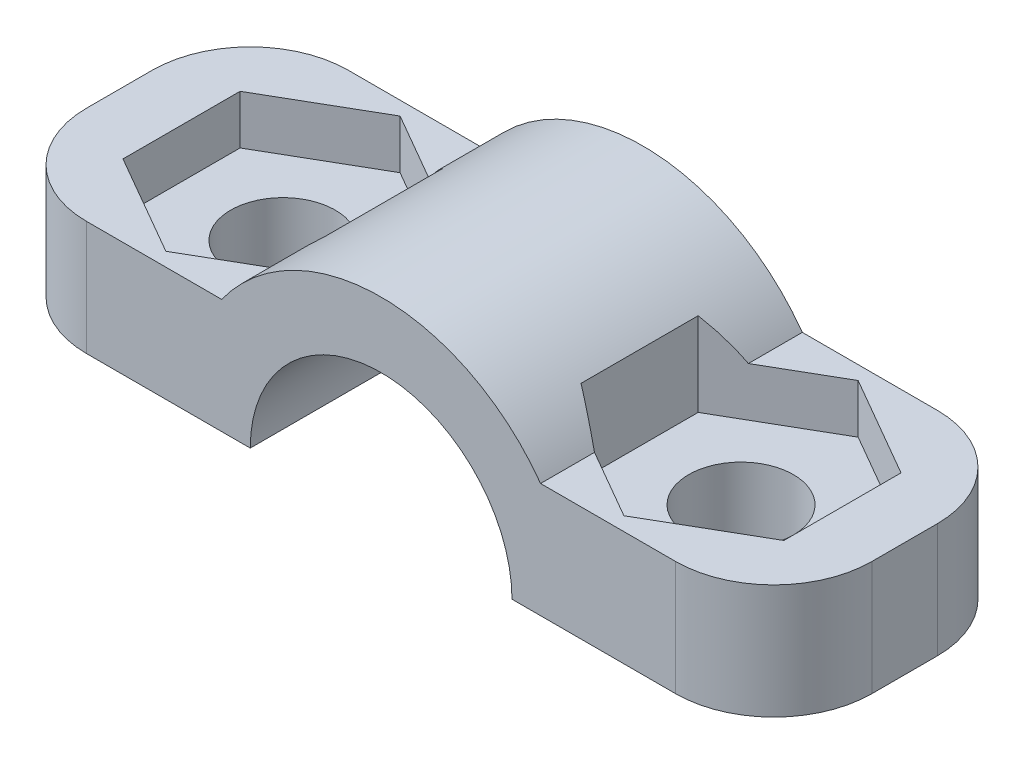
ISO-10303-21;
HEADER;
FILE_DESCRIPTION(('STEP AP214'),'2;1');
FILE_NAME('part.step','',(''),(''),'','','');
FILE_SCHEMA(('AUTOMOTIVE_DESIGN { 1 0 10303 214 1 1 1 1 }'));
ENDSEC;
DATA;
#1=APPLICATION_CONTEXT('core data for automotive mechanical design processes');
#2=APPLICATION_PROTOCOL_DEFINITION('international standard','automotive_design',2000,#1);
#3=PRODUCT_CONTEXT('',#1,'mechanical');
#4=PRODUCT('Part','Part','',(#3));
#5=PRODUCT_RELATED_PRODUCT_CATEGORY('part','',(#4));
#6=PRODUCT_DEFINITION_FORMATION('','',#4);
#7=PRODUCT_DEFINITION_CONTEXT('part definition',#1,'design');
#8=PRODUCT_DEFINITION('design','',#6,#7);
#9=PRODUCT_DEFINITION_SHAPE('','',#8);
#10=(LENGTH_UNIT() NAMED_UNIT(*) SI_UNIT(.MILLI.,.METRE.));
#11=(NAMED_UNIT(*) PLANE_ANGLE_UNIT() SI_UNIT($,.RADIAN.));
#12=(NAMED_UNIT(*) SI_UNIT($,.STERADIAN.) SOLID_ANGLE_UNIT());
#13=UNCERTAINTY_MEASURE_WITH_UNIT(LENGTH_MEASURE(1.E-05),#10,'distance_accuracy_value','');
#14=(GEOMETRIC_REPRESENTATION_CONTEXT(3) GLOBAL_UNCERTAINTY_ASSIGNED_CONTEXT((#13)) GLOBAL_UNIT_ASSIGNED_CONTEXT((#10,
#11,#12)) REPRESENTATION_CONTEXT('',''));
#15=CARTESIAN_POINT('',(0.,0.,0.));
#16=DIRECTION('',(0.,0.,1.));
#17=DIRECTION('',(1.,0.,0.));
#18=AXIS2_PLACEMENT_3D('',#15,#16,#17);
#19=CARTESIAN_POINT('',(0.,0.,8.));
#20=DIRECTION('',(0.,0.,1.));
#21=DIRECTION('',(1.,0.,0.));
#22=AXIS2_PLACEMENT_3D('',#19,#20,#21);
#23=PLANE('',#22);
#24=DIRECTION('',(-1.,0.,0.));
#25=VECTOR('',#24,1.);
#26=CARTESIAN_POINT('',(0.,3.5,8.));
#27=LINE('',#26,#25);
#28=CARTESIAN_POINT('',(-4.87339717240448,3.5,8.));
#29=VERTEX_POINT('',#28);
#30=CARTESIAN_POINT('',(-9.,3.5,8.));
#31=VERTEX_POINT('',#30);
#32=EDGE_CURVE('E236',#29,#31,#27,.T.);
#33=ORIENTED_EDGE('',*,*,#32,.T.);
#34=DIRECTION('',(0.,-1.,0.));
#35=VECTOR('',#34,1.);
#36=CARTESIAN_POINT('',(-9.,0.,8.));
#37=LINE('',#36,#35);
#38=CARTESIAN_POINT('',(-9.,0.,8.));
#39=VERTEX_POINT('',#38);
#40=EDGE_CURVE('E411',#31,#39,#37,.T.);
#41=ORIENTED_EDGE('',*,*,#40,.T.);
#42=DIRECTION('',(1.,0.,0.));
#43=VECTOR('',#42,1.);
#44=CARTESIAN_POINT('',(-4.,0.,8.));
#45=LINE('',#44,#43);
#46=CARTESIAN_POINT('',(-4.,0.,8.));
#47=VERTEX_POINT('',#46);
#48=EDGE_CURVE('E385',#39,#47,#45,.T.);
#49=ORIENTED_EDGE('',*,*,#48,.T.);
#50=CARTESIAN_POINT('',(0.,0.,8.));
#51=DIRECTION('',(0.,0.,-1.));
#52=DIRECTION('',(1.,0.,0.));
#53=AXIS2_PLACEMENT_3D('',#50,#51,#52);
#54=CIRCLE('',#53,4.);
#55=CARTESIAN_POINT('',(4.,0.,8.));
#56=VERTEX_POINT('',#55);
#57=EDGE_CURVE('E378',#47,#56,#54,.T.);
#58=ORIENTED_EDGE('',*,*,#57,.T.);
#59=DIRECTION('',(1.,0.,0.));
#60=VECTOR('',#59,1.);
#61=CARTESIAN_POINT('',(12.,0.,8.));
#62=LINE('',#61,#60);
#63=CARTESIAN_POINT('',(9.,0.,8.));
#64=VERTEX_POINT('',#63);
#65=EDGE_CURVE('E381',#56,#64,#62,.T.);
#66=ORIENTED_EDGE('',*,*,#65,.T.);
#67=DIRECTION('',(0.,1.,0.));
#68=VECTOR('',#67,1.);
#69=CARTESIAN_POINT('',(9.,6.,8.));
#70=LINE('',#69,#68);
#71=CARTESIAN_POINT('',(9.,3.5,8.));
#72=VERTEX_POINT('',#71);
#73=EDGE_CURVE('E405',#64,#72,#70,.T.);
#74=ORIENTED_EDGE('',*,*,#73,.T.);
#75=DIRECTION('',(-1.,0.,0.));
#76=VECTOR('',#75,1.);
#77=CARTESIAN_POINT('',(0.,3.5,8.));
#78=LINE('',#77,#76);
#79=CARTESIAN_POINT('',(4.87339717240448,3.5,8.));
#80=VERTEX_POINT('',#79);
#81=EDGE_CURVE('E239',#72,#80,#78,.T.);
#82=ORIENTED_EDGE('',*,*,#81,.T.);
#83=CARTESIAN_POINT('',(0.,0.,8.));
#84=DIRECTION('',(0.,0.,-1.));
#85=DIRECTION('',(-1.,0.,0.));
#86=AXIS2_PLACEMENT_3D('',#83,#84,#85);
#87=CIRCLE('',#86,6.);
#88=EDGE_CURVE('E233',#80,#29,#87,.F.);
#89=ORIENTED_EDGE('',*,*,#88,.T.);
#90=EDGE_LOOP('',(#33,#41,#49,#58,#66,#74,#82,#89));
#91=FACE_BOUND('',#90,.T.);
#92=ADVANCED_FACE('F59',(#91),#23,.T.);
#93=CARTESIAN_POINT('',(0.,0.,0.));
#94=DIRECTION('',(0.,0.,1.));
#95=DIRECTION('',(1.,0.,0.));
#96=AXIS2_PLACEMENT_3D('',#93,#94,#95);
#97=PLANE('',#96);
#98=DIRECTION('',(0.,-1.,0.));
#99=VECTOR('',#98,1.);
#100=CARTESIAN_POINT('',(-9.,0.,0.));
#101=LINE('',#100,#99);
#102=CARTESIAN_POINT('',(-9.,0.,0.));
#103=VERTEX_POINT('',#102);
#104=CARTESIAN_POINT('',(-9.,3.5,0.));
#105=VERTEX_POINT('',#104);
#106=EDGE_CURVE('E424',#103,#105,#101,.F.);
#107=ORIENTED_EDGE('',*,*,#106,.T.);
#108=DIRECTION('',(-1.,0.,0.));
#109=VECTOR('',#108,1.);
#110=CARTESIAN_POINT('',(0.,3.5,0.));
#111=LINE('',#110,#109);
#112=CARTESIAN_POINT('',(-4.87339717240448,3.5,0.));
#113=VERTEX_POINT('',#112);
#114=EDGE_CURVE('E254',#113,#105,#111,.T.);
#115=ORIENTED_EDGE('',*,*,#114,.F.);
#116=CARTESIAN_POINT('',(0.,0.,0.));
#117=DIRECTION('',(0.,0.,-1.));
#118=DIRECTION('',(-1.,0.,0.));
#119=AXIS2_PLACEMENT_3D('',#116,#117,#118);
#120=CIRCLE('',#119,6.);
#121=CARTESIAN_POINT('',(4.87339717240448,3.5,0.));
#122=VERTEX_POINT('',#121);
#123=EDGE_CURVE('E279',#122,#113,#120,.F.);
#124=ORIENTED_EDGE('',*,*,#123,.F.);
#125=DIRECTION('',(-1.,0.,0.));
#126=VECTOR('',#125,1.);
#127=CARTESIAN_POINT('',(0.,3.5,0.));
#128=LINE('',#127,#126);
#129=CARTESIAN_POINT('',(9.,3.5,0.));
#130=VERTEX_POINT('',#129);
#131=EDGE_CURVE('E278',#130,#122,#128,.T.);
#132=ORIENTED_EDGE('',*,*,#131,.F.);
#133=DIRECTION('',(0.,1.,0.));
#134=VECTOR('',#133,1.);
#135=CARTESIAN_POINT('',(9.,0.,0.));
#136=LINE('',#135,#134);
#137=CARTESIAN_POINT('',(9.,0.,0.));
#138=VERTEX_POINT('',#137);
#139=EDGE_CURVE('E422',#130,#138,#136,.F.);
#140=ORIENTED_EDGE('',*,*,#139,.T.);
#141=DIRECTION('',(1.,0.,0.));
#142=VECTOR('',#141,1.);
#143=CARTESIAN_POINT('',(12.,0.,0.));
#144=LINE('',#143,#142);
#145=CARTESIAN_POINT('',(4.,0.,0.));
#146=VERTEX_POINT('',#145);
#147=EDGE_CURVE('E390',#146,#138,#144,.T.);
#148=ORIENTED_EDGE('',*,*,#147,.F.);
#149=CARTESIAN_POINT('',(0.,0.,0.));
#150=DIRECTION('',(0.,0.,-1.));
#151=DIRECTION('',(1.,0.,0.));
#152=AXIS2_PLACEMENT_3D('',#149,#150,#151);
#153=CIRCLE('',#152,4.);
#154=CARTESIAN_POINT('',(-4.,0.,0.));
#155=VERTEX_POINT('',#154);
#156=EDGE_CURVE('E373',#155,#146,#153,.T.);
#157=ORIENTED_EDGE('',*,*,#156,.F.);
#158=DIRECTION('',(1.,0.,0.));
#159=VECTOR('',#158,1.);
#160=CARTESIAN_POINT('',(-4.,0.,0.));
#161=LINE('',#160,#159);
#162=EDGE_CURVE('E382',#103,#155,#161,.T.);
#163=ORIENTED_EDGE('',*,*,#162,.F.);
#164=EDGE_LOOP('',(#107,#115,#124,#132,#140,#148,#157,#163));
#165=FACE_BOUND('',#164,.T.);
#166=ADVANCED_FACE('F486',(#165),#97,.F.);
#167=CARTESIAN_POINT('',(-3.9,-9.47065643624207,2.21021416551216));
#168=DIRECTION('',(0.5,0.,-0.866025403784439));
#169=DIRECTION('',(-0.866025403784439,0.,-0.5));
#170=AXIS2_PLACEMENT_3D('',#167,#168,#169);
#171=PLANE('',#170);
#172=CARTESIAN_POINT('',(0.,0.,4.4618802153517));
#173=DIRECTION('',(0.5,0.,-0.866025403784439));
#174=DIRECTION('',(-0.866025403784439,0.,-0.5));
#175=AXIS2_PLACEMENT_3D('',#172,#173,#174);
#176=ELLIPSE('',#175,6.92820323027551,6.);
#177=CARTESIAN_POINT('',(-3.9,4.5596052460712,2.21021416551216));
#178=VERTEX_POINT('',#177);
#179=CARTESIAN_POINT('',(-4.87339717240448,3.5,1.64822304599601));
#180=VERTEX_POINT('',#179);
#181=EDGE_CURVE('E275',#178,#180,#176,.F.);
#182=ORIENTED_EDGE('',*,*,#181,.T.);
#183=DIRECTION('',(-0.866025403784439,0.,-0.5));
#184=VECTOR('',#183,1.);
#185=CARTESIAN_POINT('',(-3.9,3.5,2.21021416551216));
#186=LINE('',#185,#184);
#187=CARTESIAN_POINT('',(-7.,3.5,0.420428331024321));
#188=VERTEX_POINT('',#187);
#189=EDGE_CURVE('E269',#180,#188,#186,.T.);
#190=ORIENTED_EDGE('',*,*,#189,.T.);
#191=DIRECTION('',(0.,1.,0.));
#192=VECTOR('',#191,1.);
#193=CARTESIAN_POINT('',(-7.,-9.47065643624207,0.420428331024321));
#194=LINE('',#193,#192);
#195=CARTESIAN_POINT('',(-7.,2.,0.420428331024321));
#196=VERTEX_POINT('',#195);
#197=EDGE_CURVE('E309',#196,#188,#194,.T.);
#198=ORIENTED_EDGE('',*,*,#197,.F.);
#199=DIRECTION('',(0.866025403784439,0.,0.5));
#200=VECTOR('',#199,1.);
#201=CARTESIAN_POINT('',(-3.9,2.,2.21021416551216));
#202=LINE('',#201,#200);
#203=CARTESIAN_POINT('',(-3.9,2.,2.21021416551216));
#204=VERTEX_POINT('',#203);
#205=EDGE_CURVE('E351',#196,#204,#202,.T.);
#206=ORIENTED_EDGE('',*,*,#205,.T.);
#207=DIRECTION('',(0.,1.,0.));
#208=VECTOR('',#207,1.);
#209=CARTESIAN_POINT('',(-3.9,-9.47065643624207,2.21021416551216));
#210=LINE('',#209,#208);
#211=EDGE_CURVE('E345',#204,#178,#210,.T.);
#212=ORIENTED_EDGE('',*,*,#211,.T.);
#213=EDGE_LOOP('',(#182,#190,#198,#206,#212));
#214=FACE_BOUND('',#213,.T.);
#215=ADVANCED_FACE('F490',(#214),#171,.F.);
#216=CARTESIAN_POINT('',(-7.,-9.47065643624207,7.57957166897568));
#217=DIRECTION('',(0.5,0.,0.866025403784438));
#218=DIRECTION('',(0.866025403784439,0.,-0.5));
#219=AXIS2_PLACEMENT_3D('',#216,#217,#218);
#220=PLANE('',#219);
#221=DIRECTION('',(0.,1.,0.));
#222=VECTOR('',#221,1.);
#223=CARTESIAN_POINT('',(-7.,-9.47065643624207,7.57957166897568));
#224=LINE('',#223,#222);
#225=CARTESIAN_POINT('',(-7.,2.,7.57957166897568));
#226=VERTEX_POINT('',#225);
#227=CARTESIAN_POINT('',(-7.,3.5,7.57957166897568));
#228=VERTEX_POINT('',#227);
#229=EDGE_CURVE('E358',#226,#228,#224,.T.);
#230=ORIENTED_EDGE('',*,*,#229,.T.);
#231=DIRECTION('',(0.866025403784439,0.,-0.5));
#232=VECTOR('',#231,1.);
#233=CARTESIAN_POINT('',(-7.,3.5,7.57957166897568));
#234=LINE('',#233,#232);
#235=CARTESIAN_POINT('',(-4.87339717240448,3.5,6.35177695400399));
#236=VERTEX_POINT('',#235);
#237=EDGE_CURVE('E267',#228,#236,#234,.T.);
#238=ORIENTED_EDGE('',*,*,#237,.T.);
#239=CARTESIAN_POINT('',(0.,0.,3.5381197846483));
#240=DIRECTION('',(0.5,0.,0.866025403784438));
#241=DIRECTION('',(0.866025403784439,0.,-0.5));
#242=AXIS2_PLACEMENT_3D('',#239,#240,#241);
#243=ELLIPSE('',#242,6.92820323027551,6.);
#244=CARTESIAN_POINT('',(-3.9,4.5596052460712,5.78978583448784));
#245=VERTEX_POINT('',#244);
#246=EDGE_CURVE('E13',#236,#245,#243,.F.);
#247=ORIENTED_EDGE('',*,*,#246,.T.);
#248=DIRECTION('',(0.,1.,0.));
#249=VECTOR('',#248,1.);
#250=CARTESIAN_POINT('',(-3.9,-9.47065643624207,5.78978583448784));
#251=LINE('',#250,#249);
#252=CARTESIAN_POINT('',(-3.9,2.,5.78978583448784));
#253=VERTEX_POINT('',#252);
#254=EDGE_CURVE('E355',#253,#245,#251,.T.);
#255=ORIENTED_EDGE('',*,*,#254,.F.);
#256=DIRECTION('',(-0.866025403784439,0.,0.5));
#257=VECTOR('',#256,1.);
#258=CARTESIAN_POINT('',(-7.,2.,7.57957166897568));
#259=LINE('',#258,#257);
#260=EDGE_CURVE('E347',#253,#226,#259,.T.);
#261=ORIENTED_EDGE('',*,*,#260,.T.);
#262=EDGE_LOOP('',(#230,#238,#247,#255,#261));
#263=FACE_BOUND('',#262,.T.);
#264=ADVANCED_FACE('F507',(#263),#220,.F.);
#265=CARTESIAN_POINT('',(3.9,-9.47065643624207,5.78978583448784));
#266=DIRECTION('',(-0.5,0.,0.866025403784439));
#267=DIRECTION('',(0.866025403784439,0.,0.5));
#268=AXIS2_PLACEMENT_3D('',#265,#266,#267);
#269=PLANE('',#268);
#270=CARTESIAN_POINT('',(0.,0.,3.5381197846483));
#271=DIRECTION('',(-0.5,0.,0.866025403784439));
#272=DIRECTION('',(-0.866025403784439,0.,-0.5));
#273=AXIS2_PLACEMENT_3D('',#270,#271,#272);
#274=ELLIPSE('',#273,6.92820323027551,6.);
#275=CARTESIAN_POINT('',(3.9,4.5596052460712,5.78978583448784));
#276=VERTEX_POINT('',#275);
#277=CARTESIAN_POINT('',(4.87339717240448,3.5,6.35177695400399));
#278=VERTEX_POINT('',#277);
#279=EDGE_CURVE('E306',#276,#278,#274,.F.);
#280=ORIENTED_EDGE('',*,*,#279,.T.);
#281=DIRECTION('',(0.866025403784439,0.,0.5));
#282=VECTOR('',#281,1.);
#283=CARTESIAN_POINT('',(3.9,3.5,5.78978583448784));
#284=LINE('',#283,#282);
#285=CARTESIAN_POINT('',(7.,3.5,7.57957166897568));
#286=VERTEX_POINT('',#285);
#287=EDGE_CURVE('E302',#278,#286,#284,.T.);
#288=ORIENTED_EDGE('',*,*,#287,.T.);
#289=DIRECTION('',(0.,1.,0.));
#290=VECTOR('',#289,1.);
#291=CARTESIAN_POINT('',(7.,-9.47065643624207,7.57957166897568));
#292=LINE('',#291,#290);
#293=CARTESIAN_POINT('',(7.,2.,7.57957166897568));
#294=VERTEX_POINT('',#293);
#295=EDGE_CURVE('E327',#294,#286,#292,.T.);
#296=ORIENTED_EDGE('',*,*,#295,.F.);
#297=DIRECTION('',(-0.866025403784439,0.,-0.5));
#298=VECTOR('',#297,1.);
#299=CARTESIAN_POINT('',(3.9,2.,5.78978583448784));
#300=LINE('',#299,#298);
#301=CARTESIAN_POINT('',(3.9,2.,5.78978583448784));
#302=VERTEX_POINT('',#301);
#303=EDGE_CURVE('E312',#294,#302,#300,.T.);
#304=ORIENTED_EDGE('',*,*,#303,.T.);
#305=DIRECTION('',(0.,1.,0.));
#306=VECTOR('',#305,1.);
#307=CARTESIAN_POINT('',(3.9,-9.47065643624207,5.78978583448784));
#308=LINE('',#307,#306);
#309=EDGE_CURVE('E330',#302,#276,#308,.T.);
#310=ORIENTED_EDGE('',*,*,#309,.T.);
#311=EDGE_LOOP('',(#280,#288,#296,#304,#310));
#312=FACE_BOUND('',#311,.T.);
#313=ADVANCED_FACE('F577',(#312),#269,.F.);
#314=CARTESIAN_POINT('',(7.,-9.47065643624207,0.420428331024321));
#315=DIRECTION('',(-0.5,0.,-0.866025403784439));
#316=DIRECTION('',(-0.866025403784439,0.,0.5));
#317=AXIS2_PLACEMENT_3D('',#314,#315,#316);
#318=PLANE('',#317);
#319=DIRECTION('',(0.,1.,0.));
#320=VECTOR('',#319,1.);
#321=CARTESIAN_POINT('',(7.,-9.47065643624207,0.420428331024321));
#322=LINE('',#321,#320);
#323=CARTESIAN_POINT('',(7.,2.,0.420428331024321));
#324=VERTEX_POINT('',#323);
#325=CARTESIAN_POINT('',(7.,3.5,0.420428331024321));
#326=VERTEX_POINT('',#325);
#327=EDGE_CURVE('E336',#324,#326,#322,.T.);
#328=ORIENTED_EDGE('',*,*,#327,.T.);
#329=DIRECTION('',(-0.866025403784439,0.,0.5));
#330=VECTOR('',#329,1.);
#331=CARTESIAN_POINT('',(7.,3.5,0.420428331024322));
#332=LINE('',#331,#330);
#333=CARTESIAN_POINT('',(4.87339717240448,3.5,1.64822304599601));
#334=VERTEX_POINT('',#333);
#335=EDGE_CURVE('E290',#326,#334,#332,.T.);
#336=ORIENTED_EDGE('',*,*,#335,.T.);
#337=CARTESIAN_POINT('',(0.,0.,4.4618802153517));
#338=DIRECTION('',(-0.5,0.,-0.866025403784439));
#339=DIRECTION('',(0.866025403784439,0.,-0.5));
#340=AXIS2_PLACEMENT_3D('',#337,#338,#339);
#341=ELLIPSE('',#340,6.92820323027551,6.);
#342=CARTESIAN_POINT('',(3.9,4.55960524607119,2.21021416551216));
#343=VERTEX_POINT('',#342);
#344=EDGE_CURVE('E438',#334,#343,#341,.F.);
#345=ORIENTED_EDGE('',*,*,#344,.T.);
#346=DIRECTION('',(0.,1.,0.));
#347=VECTOR('',#346,1.);
#348=CARTESIAN_POINT('',(3.9,-9.47065643624207,2.21021416551216));
#349=LINE('',#348,#347);
#350=CARTESIAN_POINT('',(3.9,2.,2.21021416551216));
#351=VERTEX_POINT('',#350);
#352=EDGE_CURVE('E333',#351,#343,#349,.T.);
#353=ORIENTED_EDGE('',*,*,#352,.F.);
#354=DIRECTION('',(0.866025403784439,0.,-0.5));
#355=VECTOR('',#354,1.);
#356=CARTESIAN_POINT('',(7.,2.,0.420428331024322));
#357=LINE('',#356,#355);
#358=EDGE_CURVE('E321',#351,#324,#357,.T.);
#359=ORIENTED_EDGE('',*,*,#358,.T.);
#360=EDGE_LOOP('',(#328,#336,#345,#353,#359));
#361=FACE_BOUND('',#360,.T.);
#362=ADVANCED_FACE('F580',(#361),#318,.F.);
#363=CARTESIAN_POINT('',(-7.,6.00100000000001,4.));
#364=DIRECTION('',(0.,-1.,0.));
#365=DIRECTION('',(1.,0.,0.));
#366=AXIS2_PLACEMENT_3D('',#363,#364,#365);
#367=CYLINDRICAL_SURFACE('',#366,1.6);
#368=CARTESIAN_POINT('',(-7.,0.,4.));
#369=DIRECTION('',(0.,-1.,0.));
#370=DIRECTION('',(1.,0.,0.));
#371=AXIS2_PLACEMENT_3D('',#368,#369,#370);
#372=CIRCLE('',#371,1.6);
#373=CARTESIAN_POINT('',(-5.4,0.,4.));
#374=VERTEX_POINT('',#373);
#375=EDGE_CURVE('E374',#374,#374,#372,.T.);
#376=CARTESIAN_POINT('',(-7.,2.,4.));
#377=DIRECTION('',(0.,1.,0.));
#378=DIRECTION('',(-1.,0.,0.));
#379=AXIS2_PLACEMENT_3D('',#376,#377,#378);
#380=CIRCLE('',#379,1.6);
#381=CARTESIAN_POINT('',(-5.4,2.,4.));
#382=VERTEX_POINT('',#381);
#383=EDGE_CURVE('E377',#382,#382,#380,.F.);
#384=CARTESIAN_POINT('',(-5.4,0.,4.));
#385=CARTESIAN_POINT('',(-5.4,0.0208333333333342,4.));
#386=CARTESIAN_POINT('',(-5.4,0.0416666666666676,4.));
#387=CARTESIAN_POINT('',(-5.4,0.0833333333333343,4.));
#388=CARTESIAN_POINT('',(-5.4,0.104166666666668,4.));
#389=CARTESIAN_POINT('',(-5.4,0.145833333333334,4.));
#390=CARTESIAN_POINT('',(-5.4,0.166666666666668,4.));
#391=CARTESIAN_POINT('',(-5.4,0.208333333333334,4.));
#392=CARTESIAN_POINT('',(-5.4,0.229166666666668,4.));
#393=CARTESIAN_POINT('',(-5.4,0.270833333333334,4.));
#394=CARTESIAN_POINT('',(-5.4,0.291666666666667,4.));
#395=CARTESIAN_POINT('',(-5.4,0.333333333333334,4.));
#396=CARTESIAN_POINT('',(-5.4,0.354166666666667,4.));
#397=CARTESIAN_POINT('',(-5.4,0.395833333333334,4.));
#398=CARTESIAN_POINT('',(-5.4,0.416666666666667,4.));
#399=CARTESIAN_POINT('',(-5.4,0.458333333333334,4.));
#400=CARTESIAN_POINT('',(-5.4,0.479166666666667,4.));
#401=CARTESIAN_POINT('',(-5.4,0.520833333333334,4.));
#402=CARTESIAN_POINT('',(-5.4,0.541666666666667,4.));
#403=CARTESIAN_POINT('',(-5.4,0.583333333333334,4.));
#404=CARTESIAN_POINT('',(-5.4,0.604166666666667,4.));
#405=CARTESIAN_POINT('',(-5.4,0.645833333333334,4.));
#406=CARTESIAN_POINT('',(-5.4,0.666666666666667,4.));
#407=CARTESIAN_POINT('',(-5.4,0.708333333333334,4.));
#408=CARTESIAN_POINT('',(-5.4,0.729166666666667,4.));
#409=CARTESIAN_POINT('',(-5.4,0.770833333333333,4.));
#410=CARTESIAN_POINT('',(-5.4,0.791666666666667,4.));
#411=CARTESIAN_POINT('',(-5.4,0.833333333333333,4.));
#412=CARTESIAN_POINT('',(-5.4,0.854166666666667,4.));
#413=CARTESIAN_POINT('',(-5.4,0.895833333333333,4.));
#414=CARTESIAN_POINT('',(-5.4,0.916666666666667,4.));
#415=CARTESIAN_POINT('',(-5.4,0.958333333333333,4.));
#416=CARTESIAN_POINT('',(-5.4,0.979166666666667,4.));
#417=CARTESIAN_POINT('',(-5.4,1.02083333333333,4.));
#418=CARTESIAN_POINT('',(-5.4,1.04166666666667,4.));
#419=CARTESIAN_POINT('',(-5.4,1.08333333333333,4.));
#420=CARTESIAN_POINT('',(-5.4,1.10416666666667,4.));
#421=CARTESIAN_POINT('',(-5.4,1.14583333333333,4.));
#422=CARTESIAN_POINT('',(-5.4,1.16666666666667,4.));
#423=CARTESIAN_POINT('',(-5.4,1.20833333333333,4.));
#424=CARTESIAN_POINT('',(-5.4,1.22916666666667,4.));
#425=CARTESIAN_POINT('',(-5.4,1.27083333333333,4.));
#426=CARTESIAN_POINT('',(-5.4,1.29166666666667,4.));
#427=CARTESIAN_POINT('',(-5.4,1.33333333333333,4.));
#428=CARTESIAN_POINT('',(-5.4,1.35416666666667,4.));
#429=CARTESIAN_POINT('',(-5.4,1.39583333333333,4.));
#430=CARTESIAN_POINT('',(-5.4,1.41666666666667,4.));
#431=CARTESIAN_POINT('',(-5.4,1.45833333333333,4.));
#432=CARTESIAN_POINT('',(-5.4,1.47916666666667,4.));
#433=CARTESIAN_POINT('',(-5.4,1.52083333333333,4.));
#434=CARTESIAN_POINT('',(-5.4,1.54166666666667,4.));
#435=CARTESIAN_POINT('',(-5.4,1.58333333333333,4.));
#436=CARTESIAN_POINT('',(-5.4,1.60416666666667,4.));
#437=CARTESIAN_POINT('',(-5.4,1.64583333333333,4.));
#438=CARTESIAN_POINT('',(-5.4,1.66666666666667,4.));
#439=CARTESIAN_POINT('',(-5.4,1.70833333333333,4.));
#440=CARTESIAN_POINT('',(-5.4,1.72916666666667,4.));
#441=CARTESIAN_POINT('',(-5.4,1.77083333333333,4.));
#442=CARTESIAN_POINT('',(-5.4,1.79166666666667,4.));
#443=CARTESIAN_POINT('',(-5.4,1.83333333333333,4.));
#444=CARTESIAN_POINT('',(-5.4,1.85416666666667,4.));
#445=CARTESIAN_POINT('',(-5.4,1.89583333333333,4.));
#446=CARTESIAN_POINT('',(-5.4,1.91666666666667,4.));
#447=CARTESIAN_POINT('',(-5.4,1.95833333333333,4.));
#448=CARTESIAN_POINT('',(-5.4,1.97916666666667,4.));
#449=CARTESIAN_POINT('',(-5.4,2.,4.));
#450=B_SPLINE_CURVE_WITH_KNOTS('',3,(#384,#385,#386,#387,#388,#389,#390,#391,#392,#393,#394,
#395,#396,#397,#398,#399,#400,#401,#402,#403,#404,#405,#406,#407,#408,#409,#410,#411,#412,#413,
#414,#415,#416,#417,#418,#419,#420,#421,#422,#423,#424,#425,#426,#427,#428,#429,#430,#431,#432,
#433,#434,#435,#436,#437,#438,#439,#440,#441,#442,#443,#444,#445,#446,#447,#448,#449),
.UNSPECIFIED.,.F.,.F.,(4,2,2,2,2,2,2,2,2,2,2,2,2,2,2,2,2,2,2,2,2,2,2,2,2,2,2,2,2,2,2,2,4),(0.,
0.0625000000000001,0.125,0.1875,0.25,0.312499999999999,0.374999999999999,0.4375,0.5,0.5625,
0.625,0.6875,0.749999999999999,0.812499999999999,0.874999999999999,0.937499999999999,
0.999999999999999,1.0625,1.125,1.1875,1.25,1.3125,1.375,1.4375,1.5,1.5625,1.625,1.6875,1.75,
1.8125,1.875,1.9375,2.),.UNSPECIFIED.);
#451=EDGE_CURVE('BSEAM530',#374,#382,#450,.T.);
#452=ORIENTED_EDGE('',*,*,#375,.T.);
#453=ORIENTED_EDGE('',*,*,#383,.F.);
#454=ORIENTED_EDGE('',*,*,#451,.T.);
#455=ORIENTED_EDGE('',*,*,#451,.F.);
#456=EDGE_LOOP('',(#452,#454,#453,#455));
#457=FACE_BOUND('',#456,.T.);
#458=ADVANCED_FACE('F530',(#457),#367,.F.);
#459=CARTESIAN_POINT('',(7.,6.001,4.));
#460=DIRECTION('',(0.,-1.,0.));
#461=DIRECTION('',(1.,0.,0.));
#462=AXIS2_PLACEMENT_3D('',#459,#460,#461);
#463=CYLINDRICAL_SURFACE('',#462,1.6);
#464=CARTESIAN_POINT('',(7.,0.,4.));
#465=DIRECTION('',(0.,-1.,0.));
#466=DIRECTION('',(1.,0.,0.));
#467=AXIS2_PLACEMENT_3D('',#464,#465,#466);
#468=CIRCLE('',#467,1.6);
#469=CARTESIAN_POINT('',(8.6,0.,4.));
#470=VERTEX_POINT('',#469);
#471=EDGE_CURVE('E370',#470,#470,#468,.T.);
#472=CARTESIAN_POINT('',(7.,2.,4.));
#473=DIRECTION('',(0.,1.,0.));
#474=DIRECTION('',(-1.,0.,0.));
#475=AXIS2_PLACEMENT_3D('',#472,#473,#474);
#476=CIRCLE('',#475,1.6);
#477=CARTESIAN_POINT('',(8.6,2.,4.));
#478=VERTEX_POINT('',#477);
#479=EDGE_CURVE('E341',#478,#478,#476,.F.);
#480=CARTESIAN_POINT('',(8.6,0.,4.));
#481=CARTESIAN_POINT('',(8.6,0.0208333333333325,4.));
#482=CARTESIAN_POINT('',(8.6,0.0416666666666658,4.));
#483=CARTESIAN_POINT('',(8.6,0.0833333333333326,4.));
#484=CARTESIAN_POINT('',(8.6,0.104166666666666,4.));
#485=CARTESIAN_POINT('',(8.6,0.145833333333333,4.));
#486=CARTESIAN_POINT('',(8.6,0.166666666666666,4.));
#487=CARTESIAN_POINT('',(8.6,0.208333333333333,4.));
#488=CARTESIAN_POINT('',(8.6,0.229166666666666,4.));
#489=CARTESIAN_POINT('',(8.6,0.270833333333333,4.));
#490=CARTESIAN_POINT('',(8.6,0.291666666666666,4.));
#491=CARTESIAN_POINT('',(8.6,0.333333333333333,4.));
#492=CARTESIAN_POINT('',(8.6,0.354166666666666,4.));
#493=CARTESIAN_POINT('',(8.6,0.395833333333333,4.));
#494=CARTESIAN_POINT('',(8.6,0.416666666666666,4.));
#495=CARTESIAN_POINT('',(8.6,0.458333333333333,4.));
#496=CARTESIAN_POINT('',(8.6,0.479166666666666,4.));
#497=CARTESIAN_POINT('',(8.6,0.520833333333333,4.));
#498=CARTESIAN_POINT('',(8.6,0.541666666666666,4.));
#499=CARTESIAN_POINT('',(8.6,0.583333333333333,4.));
#500=CARTESIAN_POINT('',(8.6,0.604166666666666,4.));
#501=CARTESIAN_POINT('',(8.6,0.645833333333333,4.));
#502=CARTESIAN_POINT('',(8.6,0.666666666666666,4.));
#503=CARTESIAN_POINT('',(8.6,0.708333333333333,4.));
#504=CARTESIAN_POINT('',(8.6,0.729166666666667,4.));
#505=CARTESIAN_POINT('',(8.6,0.770833333333333,4.));
#506=CARTESIAN_POINT('',(8.6,0.791666666666667,4.));
#507=CARTESIAN_POINT('',(8.6,0.833333333333333,4.));
#508=CARTESIAN_POINT('',(8.6,0.854166666666667,4.));
#509=CARTESIAN_POINT('',(8.6,0.895833333333333,4.));
#510=CARTESIAN_POINT('',(8.6,0.916666666666667,4.));
#511=CARTESIAN_POINT('',(8.6,0.958333333333333,4.));
#512=CARTESIAN_POINT('',(8.6,0.979166666666667,4.));
#513=CARTESIAN_POINT('',(8.6,1.02083333333333,4.));
#514=CARTESIAN_POINT('',(8.6,1.04166666666667,4.));
#515=CARTESIAN_POINT('',(8.6,1.08333333333333,4.));
#516=CARTESIAN_POINT('',(8.6,1.10416666666667,4.));
#517=CARTESIAN_POINT('',(8.6,1.14583333333333,4.));
#518=CARTESIAN_POINT('',(8.6,1.16666666666667,4.));
#519=CARTESIAN_POINT('',(8.6,1.20833333333333,4.));
#520=CARTESIAN_POINT('',(8.6,1.22916666666667,4.));
#521=CARTESIAN_POINT('',(8.6,1.27083333333333,4.));
#522=CARTESIAN_POINT('',(8.6,1.29166666666667,4.));
#523=CARTESIAN_POINT('',(8.6,1.33333333333333,4.));
#524=CARTESIAN_POINT('',(8.6,1.35416666666667,4.));
#525=CARTESIAN_POINT('',(8.6,1.39583333333333,4.));
#526=CARTESIAN_POINT('',(8.6,1.41666666666667,4.));
#527=CARTESIAN_POINT('',(8.6,1.45833333333333,4.));
#528=CARTESIAN_POINT('',(8.6,1.47916666666667,4.));
#529=CARTESIAN_POINT('',(8.6,1.52083333333333,4.));
#530=CARTESIAN_POINT('',(8.6,1.54166666666667,4.));
#531=CARTESIAN_POINT('',(8.6,1.58333333333333,4.));
#532=CARTESIAN_POINT('',(8.6,1.60416666666667,4.));
#533=CARTESIAN_POINT('',(8.6,1.64583333333333,4.));
#534=CARTESIAN_POINT('',(8.6,1.66666666666667,4.));
#535=CARTESIAN_POINT('',(8.6,1.70833333333333,4.));
#536=CARTESIAN_POINT('',(8.6,1.72916666666667,4.));
#537=CARTESIAN_POINT('',(8.6,1.77083333333333,4.));
#538=CARTESIAN_POINT('',(8.6,1.79166666666667,4.));
#539=CARTESIAN_POINT('',(8.6,1.83333333333333,4.));
#540=CARTESIAN_POINT('',(8.6,1.85416666666667,4.));
#541=CARTESIAN_POINT('',(8.6,1.89583333333333,4.));
#542=CARTESIAN_POINT('',(8.6,1.91666666666667,4.));
#543=CARTESIAN_POINT('',(8.6,1.95833333333333,4.));
#544=CARTESIAN_POINT('',(8.6,1.97916666666667,4.));
#545=CARTESIAN_POINT('',(8.6,2.,4.));
#546=B_SPLINE_CURVE_WITH_KNOTS('',3,(#480,#481,#482,#483,#484,#485,#486,#487,#488,#489,#490,
#491,#492,#493,#494,#495,#496,#497,#498,#499,#500,#501,#502,#503,#504,#505,#506,#507,#508,#509,
#510,#511,#512,#513,#514,#515,#516,#517,#518,#519,#520,#521,#522,#523,#524,#525,#526,#527,#528,
#529,#530,#531,#532,#533,#534,#535,#536,#537,#538,#539,#540,#541,#542,#543,#544,#545),
.UNSPECIFIED.,.F.,.F.,(4,2,2,2,2,2,2,2,2,2,2,2,2,2,2,2,2,2,2,2,2,2,2,2,2,2,2,2,2,2,2,2,4),(0.,
0.0625000000000001,0.125,0.1875,0.25,0.3125,0.375,0.4375,0.5,0.5625,0.625000000000001,
0.687500000000001,0.750000000000001,0.812500000000001,0.875000000000001,0.937500000000001,1.,
1.0625,1.125,1.1875,1.25,1.3125,1.375,1.4375,1.5,1.5625,1.625,1.6875,1.75,1.8125,1.875,1.9375,
2.),.UNSPECIFIED.);
#547=EDGE_CURVE('BSEAM546',#470,#478,#546,.T.);
#548=ORIENTED_EDGE('',*,*,#471,.T.);
#549=ORIENTED_EDGE('',*,*,#479,.F.);
#550=ORIENTED_EDGE('',*,*,#547,.T.);
#551=ORIENTED_EDGE('',*,*,#547,.F.);
#552=EDGE_LOOP('',(#548,#550,#549,#551));
#553=FACE_BOUND('',#552,.T.);
#554=ADVANCED_FACE('F546',(#553),#463,.F.);
#555=CARTESIAN_POINT('',(0.,0.,8.));
#556=DIRECTION('',(0.,0.,-1.));
#557=DIRECTION('',(-1.,0.,0.));
#558=AXIS2_PLACEMENT_3D('',#555,#556,#557);
#559=CYLINDRICAL_SURFACE('',#558,4.);
#560=ORIENTED_EDGE('',*,*,#156,.T.);
#561=DIRECTION('',(0.,0.,-1.));
#562=VECTOR('',#561,1.);
#563=CARTESIAN_POINT('',(4.,0.,8.));
#564=LINE('',#563,#562);
#565=EDGE_CURVE('E402',#56,#146,#564,.T.);
#566=ORIENTED_EDGE('',*,*,#565,.F.);
#567=ORIENTED_EDGE('',*,*,#57,.F.);
#568=DIRECTION('',(0.,0.,-1.));
#569=VECTOR('',#568,1.);
#570=CARTESIAN_POINT('',(-4.,0.,8.));
#571=LINE('',#570,#569);
#572=EDGE_CURVE('E387',#47,#155,#571,.T.);
#573=ORIENTED_EDGE('',*,*,#572,.T.);
#574=EDGE_LOOP('',(#560,#566,#567,#573));
#575=FACE_BOUND('',#574,.T.);
#576=ADVANCED_FACE('F462',(#575),#559,.F.);
#577=CARTESIAN_POINT('',(12.,0.,8.));
#578=DIRECTION('',(0.,1.,0.));
#579=DIRECTION('',(-1.,0.,0.));
#580=AXIS2_PLACEMENT_3D('',#577,#578,#579);
#581=PLANE('',#580);
#582=ORIENTED_EDGE('',*,*,#471,.F.);
#583=EDGE_LOOP('',(#582));
#584=FACE_BOUND('',#583,.T.);
#585=DIRECTION('',(0.,0.,-1.));
#586=VECTOR('',#585,1.);
#587=CARTESIAN_POINT('',(12.,0.,8.));
#588=LINE('',#587,#586);
#589=CARTESIAN_POINT('',(12.,0.,5.));
#590=VERTEX_POINT('',#589);
#591=CARTESIAN_POINT('',(12.,0.,3.));
#592=VERTEX_POINT('',#591);
#593=EDGE_CURVE('E399',#590,#592,#588,.T.);
#594=ORIENTED_EDGE('',*,*,#593,.F.);
#595=CARTESIAN_POINT('',(9.,0.,5.));
#596=DIRECTION('',(0.,1.,0.));
#597=DIRECTION('',(-1.,0.,0.));
#598=AXIS2_PLACEMENT_3D('',#595,#596,#597);
#599=CIRCLE('',#598,3.);
#600=EDGE_CURVE('E434',#590,#64,#599,.F.);
#601=ORIENTED_EDGE('',*,*,#600,.T.);
#602=ORIENTED_EDGE('',*,*,#65,.F.);
#603=ORIENTED_EDGE('',*,*,#565,.T.);
#604=ORIENTED_EDGE('',*,*,#147,.T.);
#605=CARTESIAN_POINT('',(9.,0.,3.));
#606=DIRECTION('',(0.,1.,0.));
#607=DIRECTION('',(-1.,0.,0.));
#608=AXIS2_PLACEMENT_3D('',#605,#606,#607);
#609=CIRCLE('',#608,3.);
#610=EDGE_CURVE('E432',#138,#592,#609,.F.);
#611=ORIENTED_EDGE('',*,*,#610,.T.);
#612=EDGE_LOOP('',(#594,#601,#602,#603,#604,#611));
#613=FACE_BOUND('',#612,.T.);
#614=ADVANCED_FACE('F465',(#584,#613),#581,.F.);
#615=CARTESIAN_POINT('',(12.,6.,8.));
#616=DIRECTION('',(-1.,0.,0.));
#617=DIRECTION('',(0.,-1.,0.));
#618=AXIS2_PLACEMENT_3D('',#615,#616,#617);
#619=PLANE('',#618);
#620=DIRECTION('',(0.,1.,0.));
#621=VECTOR('',#620,1.);
#622=CARTESIAN_POINT('',(12.,6.,3.));
#623=LINE('',#622,#621);
#624=CARTESIAN_POINT('',(12.,3.5,3.));
#625=VERTEX_POINT('',#624);
#626=EDGE_CURVE('E427',#592,#625,#623,.T.);
#627=ORIENTED_EDGE('',*,*,#626,.T.);
#628=DIRECTION('',(0.,0.,-1.));
#629=VECTOR('',#628,1.);
#630=CARTESIAN_POINT('',(12.,3.5,8.));
#631=LINE('',#630,#629);
#632=CARTESIAN_POINT('',(12.,3.5,5.));
#633=VERTEX_POINT('',#632);
#634=EDGE_CURVE('E284',#633,#625,#631,.T.);
#635=ORIENTED_EDGE('',*,*,#634,.F.);
#636=DIRECTION('',(0.,1.,0.));
#637=VECTOR('',#636,1.);
#638=CARTESIAN_POINT('',(12.,0.,5.));
#639=LINE('',#638,#637);
#640=EDGE_CURVE('E430',#633,#590,#639,.F.);
#641=ORIENTED_EDGE('',*,*,#640,.T.);
#642=ORIENTED_EDGE('',*,*,#593,.T.);
#643=EDGE_LOOP('',(#627,#635,#641,#642));
#644=FACE_BOUND('',#643,.T.);
#645=ADVANCED_FACE('F478',(#644),#619,.F.);
#646=CARTESIAN_POINT('',(-12.,0.,8.));
#647=DIRECTION('',(1.,0.,0.));
#648=DIRECTION('',(0.,1.,0.));
#649=AXIS2_PLACEMENT_3D('',#646,#647,#648);
#650=PLANE('',#649);
#651=DIRECTION('',(0.,-1.,0.));
#652=VECTOR('',#651,1.);
#653=CARTESIAN_POINT('',(-12.,6.,5.));
#654=LINE('',#653,#652);
#655=CARTESIAN_POINT('',(-12.,0.,5.));
#656=VERTEX_POINT('',#655);
#657=CARTESIAN_POINT('',(-12.,3.5,5.));
#658=VERTEX_POINT('',#657);
#659=EDGE_CURVE('E419',#656,#658,#654,.F.);
#660=ORIENTED_EDGE('',*,*,#659,.T.);
#661=DIRECTION('',(0.,0.,-1.));
#662=VECTOR('',#661,1.);
#663=CARTESIAN_POINT('',(-12.,3.5,8.));
#664=LINE('',#663,#662);
#665=CARTESIAN_POINT('',(-12.,3.5,3.));
#666=VERTEX_POINT('',#665);
#667=EDGE_CURVE('E247',#658,#666,#664,.T.);
#668=ORIENTED_EDGE('',*,*,#667,.T.);
#669=DIRECTION('',(0.,-1.,0.));
#670=VECTOR('',#669,1.);
#671=CARTESIAN_POINT('',(-12.,0.,3.));
#672=LINE('',#671,#670);
#673=CARTESIAN_POINT('',(-12.,0.,3.));
#674=VERTEX_POINT('',#673);
#675=EDGE_CURVE('E417',#666,#674,#672,.T.);
#676=ORIENTED_EDGE('',*,*,#675,.T.);
#677=DIRECTION('',(0.,0.,-1.));
#678=VECTOR('',#677,1.);
#679=CARTESIAN_POINT('',(-12.,0.,8.));
#680=LINE('',#679,#678);
#681=EDGE_CURVE('E396',#656,#674,#680,.T.);
#682=ORIENTED_EDGE('',*,*,#681,.F.);
#683=EDGE_LOOP('',(#660,#668,#676,#682));
#684=FACE_BOUND('',#683,.T.);
#685=ADVANCED_FACE('F445',(#684),#650,.F.);
#686=CARTESIAN_POINT('',(-4.,0.,8.));
#687=DIRECTION('',(0.,1.,0.));
#688=DIRECTION('',(-1.,0.,0.));
#689=AXIS2_PLACEMENT_3D('',#686,#687,#688);
#690=PLANE('',#689);
#691=ORIENTED_EDGE('',*,*,#375,.F.);
#692=EDGE_LOOP('',(#691));
#693=FACE_BOUND('',#692,.T.);
#694=ORIENTED_EDGE('',*,*,#48,.F.);
#695=CARTESIAN_POINT('',(-9.,0.,5.));
#696=DIRECTION('',(0.,1.,0.));
#697=DIRECTION('',(-1.,0.,0.));
#698=AXIS2_PLACEMENT_3D('',#695,#696,#697);
#699=CIRCLE('',#698,3.);
#700=EDGE_CURVE('E415',#39,#656,#699,.F.);
#701=ORIENTED_EDGE('',*,*,#700,.T.);
#702=ORIENTED_EDGE('',*,*,#681,.T.);
#703=CARTESIAN_POINT('',(-9.,0.,3.));
#704=DIRECTION('',(0.,1.,0.));
#705=DIRECTION('',(-1.,0.,0.));
#706=AXIS2_PLACEMENT_3D('',#703,#704,#705);
#707=CIRCLE('',#706,3.);
#708=EDGE_CURVE('E413',#674,#103,#707,.F.);
#709=ORIENTED_EDGE('',*,*,#708,.T.);
#710=ORIENTED_EDGE('',*,*,#162,.T.);
#711=ORIENTED_EDGE('',*,*,#572,.F.);
#712=EDGE_LOOP('',(#694,#701,#702,#709,#710,#711));
#713=FACE_BOUND('',#712,.T.);
#714=ADVANCED_FACE('F453',(#693,#713),#690,.F.);
#715=CARTESIAN_POINT('',(12.,2.,8.));
#716=DIRECTION('',(0.,1.,0.));
#717=DIRECTION('',(-1.,0.,0.));
#718=AXIS2_PLACEMENT_3D('',#715,#716,#717);
#719=PLANE('',#718);
#720=DIRECTION('',(0.866025403784439,0.,0.5));
#721=VECTOR('',#720,1.);
#722=CARTESIAN_POINT('',(10.1,2.,2.21021416551216));
#723=LINE('',#722,#721);
#724=CARTESIAN_POINT('',(10.1,2.,2.21021416551216));
#725=VERTEX_POINT('',#724);
#726=EDGE_CURVE('E319',#324,#725,#723,.T.);
#727=ORIENTED_EDGE('',*,*,#726,.F.);
#728=ORIENTED_EDGE('',*,*,#358,.F.);
#729=DIRECTION('',(0.,0.,-1.));
#730=VECTOR('',#729,1.);
#731=CARTESIAN_POINT('',(3.9,2.,2.21021416551216));
#732=LINE('',#731,#730);
#733=EDGE_CURVE('E310',#302,#351,#732,.T.);
#734=ORIENTED_EDGE('',*,*,#733,.F.);
#735=ORIENTED_EDGE('',*,*,#303,.F.);
#736=DIRECTION('',(-0.866025403784439,0.,0.5));
#737=VECTOR('',#736,1.);
#738=CARTESIAN_POINT('',(7.,2.,7.57957166897568));
#739=LINE('',#738,#737);
#740=CARTESIAN_POINT('',(10.1,2.,5.78978583448784));
#741=VERTEX_POINT('',#740);
#742=EDGE_CURVE('E315',#741,#294,#739,.T.);
#743=ORIENTED_EDGE('',*,*,#742,.F.);
#744=DIRECTION('',(0.,0.,1.));
#745=VECTOR('',#744,1.);
#746=CARTESIAN_POINT('',(10.1,2.,5.78978583448784));
#747=LINE('',#746,#745);
#748=EDGE_CURVE('E317',#725,#741,#747,.T.);
#749=ORIENTED_EDGE('',*,*,#748,.F.);
#750=EDGE_LOOP('',(#727,#728,#734,#735,#743,#749));
#751=FACE_BOUND('',#750,.T.);
#752=ORIENTED_EDGE('',*,*,#479,.T.);
#753=EDGE_LOOP('',(#752));
#754=FACE_BOUND('',#753,.T.);
#755=ADVANCED_FACE('F535',(#751,#754),#719,.T.);
#756=CARTESIAN_POINT('',(10.1,-9.47065643624207,2.21021416551216));
#757=DIRECTION('',(0.5,0.,-0.866025403784438));
#758=DIRECTION('',(-0.866025403784439,0.,-0.5));
#759=AXIS2_PLACEMENT_3D('',#756,#757,#758);
#760=PLANE('',#759);
#761=DIRECTION('',(0.,1.,0.));
#762=VECTOR('',#761,1.);
#763=CARTESIAN_POINT('',(10.1,-9.47065643624207,2.21021416551216));
#764=LINE('',#763,#762);
#765=CARTESIAN_POINT('',(10.1,3.5,2.21021416551216));
#766=VERTEX_POINT('',#765);
#767=EDGE_CURVE('E313',#725,#766,#764,.T.);
#768=ORIENTED_EDGE('',*,*,#767,.T.);
#769=DIRECTION('',(-0.866025403784439,0.,-0.5));
#770=VECTOR('',#769,1.);
#771=CARTESIAN_POINT('',(10.1,3.5,2.21021416551216));
#772=LINE('',#771,#770);
#773=EDGE_CURVE('E293',#766,#326,#772,.T.);
#774=ORIENTED_EDGE('',*,*,#773,.T.);
#775=ORIENTED_EDGE('',*,*,#327,.F.);
#776=ORIENTED_EDGE('',*,*,#726,.T.);
#777=EDGE_LOOP('',(#768,#774,#775,#776));
#778=FACE_BOUND('',#777,.T.);
#779=ADVANCED_FACE('F566',(#778),#760,.F.);
#780=CARTESIAN_POINT('',(10.1,-9.47065643624207,5.78978583448784));
#781=DIRECTION('',(1.,0.,0.));
#782=DIRECTION('',(0.,1.,0.));
#783=AXIS2_PLACEMENT_3D('',#780,#781,#782);
#784=PLANE('',#783);
#785=DIRECTION('',(0.,1.,0.));
#786=VECTOR('',#785,1.);
#787=CARTESIAN_POINT('',(10.1,-9.47065643624207,5.78978583448784));
#788=LINE('',#787,#786);
#789=CARTESIAN_POINT('',(10.1,3.5,5.78978583448784));
#790=VERTEX_POINT('',#789);
#791=EDGE_CURVE('E324',#741,#790,#788,.T.);
#792=ORIENTED_EDGE('',*,*,#791,.T.);
#793=DIRECTION('',(0.,0.,-1.));
#794=VECTOR('',#793,1.);
#795=CARTESIAN_POINT('',(10.1,3.5,5.78978583448784));
#796=LINE('',#795,#794);
#797=EDGE_CURVE('E296',#790,#766,#796,.T.);
#798=ORIENTED_EDGE('',*,*,#797,.T.);
#799=ORIENTED_EDGE('',*,*,#767,.F.);
#800=ORIENTED_EDGE('',*,*,#748,.T.);
#801=EDGE_LOOP('',(#792,#798,#799,#800));
#802=FACE_BOUND('',#801,.T.);
#803=ADVANCED_FACE('F568',(#802),#784,.F.);
#804=CARTESIAN_POINT('',(7.,-9.47065643624207,7.57957166897568));
#805=DIRECTION('',(0.5,0.,0.866025403784438));
#806=DIRECTION('',(0.866025403784439,0.,-0.5));
#807=AXIS2_PLACEMENT_3D('',#804,#805,#806);
#808=PLANE('',#807);
#809=ORIENTED_EDGE('',*,*,#295,.T.);
#810=DIRECTION('',(0.866025403784439,0.,-0.5));
#811=VECTOR('',#810,1.);
#812=CARTESIAN_POINT('',(7.,3.5,7.57957166897568));
#813=LINE('',#812,#811);
#814=EDGE_CURVE('E299',#286,#790,#813,.T.);
#815=ORIENTED_EDGE('',*,*,#814,.T.);
#816=ORIENTED_EDGE('',*,*,#791,.F.);
#817=ORIENTED_EDGE('',*,*,#742,.T.);
#818=EDGE_LOOP('',(#809,#815,#816,#817));
#819=FACE_BOUND('',#818,.T.);
#820=ADVANCED_FACE('F571',(#819),#808,.F.);
#821=CARTESIAN_POINT('',(3.9,-9.47065643624207,2.21021416551216));
#822=DIRECTION('',(-1.,0.,0.));
#823=DIRECTION('',(0.,0.,1.));
#824=AXIS2_PLACEMENT_3D('',#821,#822,#823);
#825=PLANE('',#824);
#826=ORIENTED_EDGE('',*,*,#352,.T.);
#827=DIRECTION('',(0.,0.,-1.));
#828=VECTOR('',#827,1.);
#829=CARTESIAN_POINT('',(3.9,4.5596052460712,8.));
#830=LINE('',#829,#828);
#831=EDGE_CURVE('E82',#343,#276,#830,.F.);
#832=ORIENTED_EDGE('',*,*,#831,.T.);
#833=ORIENTED_EDGE('',*,*,#309,.F.);
#834=ORIENTED_EDGE('',*,*,#733,.T.);
#835=EDGE_LOOP('',(#826,#832,#833,#834));
#836=FACE_BOUND('',#835,.T.);
#837=ADVANCED_FACE('F575',(#836),#825,.F.);
#838=CARTESIAN_POINT('',(12.,2.,8.));
#839=DIRECTION('',(0.,1.,0.));
#840=DIRECTION('',(-1.,0.,0.));
#841=AXIS2_PLACEMENT_3D('',#838,#839,#840);
#842=PLANE('',#841);
#843=ORIENTED_EDGE('',*,*,#205,.F.);
#844=DIRECTION('',(0.866025403784439,0.,-0.5));
#845=VECTOR('',#844,1.);
#846=CARTESIAN_POINT('',(-7.,2.,0.420428331024322));
#847=LINE('',#846,#845);
#848=CARTESIAN_POINT('',(-10.1,1.99999999999999,2.21021416551216));
#849=VERTEX_POINT('',#848);
#850=EDGE_CURVE('E339',#849,#196,#847,.T.);
#851=ORIENTED_EDGE('',*,*,#850,.F.);
#852=DIRECTION('',(0.,0.,-1.));
#853=VECTOR('',#852,1.);
#854=CARTESIAN_POINT('',(-10.1,2.,2.21021416551216));
#855=LINE('',#854,#853);
#856=CARTESIAN_POINT('',(-10.1,2.,5.78978583448784));
#857=VERTEX_POINT('',#856);
#858=EDGE_CURVE('E342',#857,#849,#855,.T.);
#859=ORIENTED_EDGE('',*,*,#858,.F.);
#860=DIRECTION('',(-0.866025403784439,0.,-0.5));
#861=VECTOR('',#860,1.);
#862=CARTESIAN_POINT('',(-10.1,2.,5.78978583448784));
#863=LINE('',#862,#861);
#864=EDGE_CURVE('E344',#226,#857,#863,.T.);
#865=ORIENTED_EDGE('',*,*,#864,.F.);
#866=ORIENTED_EDGE('',*,*,#260,.F.);
#867=DIRECTION('',(0.,0.,1.));
#868=VECTOR('',#867,1.);
#869=CARTESIAN_POINT('',(-3.9,2.,5.78978583448784));
#870=LINE('',#869,#868);
#871=EDGE_CURVE('E349',#204,#253,#870,.T.);
#872=ORIENTED_EDGE('',*,*,#871,.F.);
#873=EDGE_LOOP('',(#843,#851,#859,#865,#866,#872));
#874=FACE_BOUND('',#873,.T.);
#875=ORIENTED_EDGE('',*,*,#383,.T.);
#876=EDGE_LOOP('',(#875));
#877=FACE_BOUND('',#876,.T.);
#878=ADVANCED_FACE('F499',(#874,#877),#842,.T.);
#879=CARTESIAN_POINT('',(-3.9,-9.47065643624207,5.78978583448784));
#880=DIRECTION('',(1.,0.,0.));
#881=DIRECTION('',(0.,0.,-1.));
#882=AXIS2_PLACEMENT_3D('',#879,#880,#881);
#883=PLANE('',#882);
#884=ORIENTED_EDGE('',*,*,#254,.T.);
#885=DIRECTION('',(0.,0.,-1.));
#886=VECTOR('',#885,1.);
#887=CARTESIAN_POINT('',(-3.9,4.5596052460712,8.));
#888=LINE('',#887,#886);
#889=EDGE_CURVE('E272',#245,#178,#888,.T.);
#890=ORIENTED_EDGE('',*,*,#889,.T.);
#891=ORIENTED_EDGE('',*,*,#211,.F.);
#892=ORIENTED_EDGE('',*,*,#871,.T.);
#893=EDGE_LOOP('',(#884,#890,#891,#892));
#894=FACE_BOUND('',#893,.T.);
#895=ADVANCED_FACE('F504',(#894),#883,.F.);
#896=CARTESIAN_POINT('',(-10.1,-9.47065643624207,5.78978583448784));
#897=DIRECTION('',(-0.5,0.,0.866025403784439));
#898=DIRECTION('',(0.866025403784439,0.,0.5));
#899=AXIS2_PLACEMENT_3D('',#896,#897,#898);
#900=PLANE('',#899);
#901=DIRECTION('',(0.,1.,0.));
#902=VECTOR('',#901,1.);
#903=CARTESIAN_POINT('',(-10.1,-9.47065643624207,5.78978583448784));
#904=LINE('',#903,#902);
#905=CARTESIAN_POINT('',(-10.1,3.5,5.78978583448784));
#906=VERTEX_POINT('',#905);
#907=EDGE_CURVE('E361',#857,#906,#904,.T.);
#908=ORIENTED_EDGE('',*,*,#907,.T.);
#909=DIRECTION('',(0.866025403784439,0.,0.5));
#910=VECTOR('',#909,1.);
#911=CARTESIAN_POINT('',(-10.1,3.5,5.78978583448784));
#912=LINE('',#911,#910);
#913=EDGE_CURVE('E264',#906,#228,#912,.T.);
#914=ORIENTED_EDGE('',*,*,#913,.T.);
#915=ORIENTED_EDGE('',*,*,#229,.F.);
#916=ORIENTED_EDGE('',*,*,#864,.T.);
#917=EDGE_LOOP('',(#908,#914,#915,#916));
#918=FACE_BOUND('',#917,.T.);
#919=ADVANCED_FACE('F510',(#918),#900,.F.);
#920=CARTESIAN_POINT('',(-10.1,-9.47065643624207,2.21021416551216));
#921=DIRECTION('',(-1.,0.,0.));
#922=DIRECTION('',(0.,-1.,0.));
#923=AXIS2_PLACEMENT_3D('',#920,#921,#922);
#924=PLANE('',#923);
#925=DIRECTION('',(0.,1.,0.));
#926=VECTOR('',#925,1.);
#927=CARTESIAN_POINT('',(-10.1,-9.47065643624207,2.21021416551216));
#928=LINE('',#927,#926);
#929=CARTESIAN_POINT('',(-10.1,3.5,2.21021416551216));
#930=VERTEX_POINT('',#929);
#931=EDGE_CURVE('E364',#849,#930,#928,.T.);
#932=ORIENTED_EDGE('',*,*,#931,.T.);
#933=DIRECTION('',(0.,0.,1.));
#934=VECTOR('',#933,1.);
#935=CARTESIAN_POINT('',(-10.1,3.5,2.21021416551216));
#936=LINE('',#935,#934);
#937=EDGE_CURVE('E74',#930,#906,#936,.T.);
#938=ORIENTED_EDGE('',*,*,#937,.T.);
#939=ORIENTED_EDGE('',*,*,#907,.F.);
#940=ORIENTED_EDGE('',*,*,#858,.T.);
#941=EDGE_LOOP('',(#932,#938,#939,#940));
#942=FACE_BOUND('',#941,.T.);
#943=ADVANCED_FACE('F514',(#942),#924,.F.);
#944=CARTESIAN_POINT('',(-7.,-9.47065643624207,0.420428331024321));
#945=DIRECTION('',(-0.5,0.,-0.866025403784439));
#946=DIRECTION('',(-0.866025403784439,0.,0.5));
#947=AXIS2_PLACEMENT_3D('',#944,#945,#946);
#948=PLANE('',#947);
#949=ORIENTED_EDGE('',*,*,#197,.T.);
#950=DIRECTION('',(-0.866025403784439,0.,0.5));
#951=VECTOR('',#950,1.);
#952=CARTESIAN_POINT('',(-7.,3.5,0.420428331024321));
#953=LINE('',#952,#951);
#954=EDGE_CURVE('E261',#188,#930,#953,.T.);
#955=ORIENTED_EDGE('',*,*,#954,.T.);
#956=ORIENTED_EDGE('',*,*,#931,.F.);
#957=ORIENTED_EDGE('',*,*,#850,.T.);
#958=EDGE_LOOP('',(#949,#955,#956,#957));
#959=FACE_BOUND('',#958,.T.);
#960=ADVANCED_FACE('F492',(#959),#948,.F.);
#961=CARTESIAN_POINT('',(-9.,0.,5.));
#962=DIRECTION('',(0.,1.,0.));
#963=DIRECTION('',(-1.,0.,0.));
#964=AXIS2_PLACEMENT_3D('',#961,#962,#963);
#965=CYLINDRICAL_SURFACE('',#964,3.);
#966=CARTESIAN_POINT('',(-9.,3.5,5.));
#967=DIRECTION('',(0.,-1.,0.));
#968=DIRECTION('',(0.,0.,-1.));
#969=AXIS2_PLACEMENT_3D('',#966,#967,#968);
#970=CIRCLE('',#969,3.);
#971=EDGE_CURVE('E253',#658,#31,#970,.F.);
#972=ORIENTED_EDGE('',*,*,#971,.F.);
#973=ORIENTED_EDGE('',*,*,#659,.F.);
#974=ORIENTED_EDGE('',*,*,#700,.F.);
#975=ORIENTED_EDGE('',*,*,#40,.F.);
#976=EDGE_LOOP('',(#972,#973,#974,#975));
#977=FACE_BOUND('',#976,.T.);
#978=ADVANCED_FACE('F456',(#977),#965,.T.);
#979=CARTESIAN_POINT('',(-9.,0.,3.));
#980=DIRECTION('',(0.,-1.,0.));
#981=DIRECTION('',(1.,0.,0.));
#982=AXIS2_PLACEMENT_3D('',#979,#980,#981);
#983=CYLINDRICAL_SURFACE('',#982,3.);
#984=CARTESIAN_POINT('',(-9.,3.5,3.));
#985=DIRECTION('',(0.,-1.,0.));
#986=DIRECTION('',(0.,0.,-1.));
#987=AXIS2_PLACEMENT_3D('',#984,#985,#986);
#988=CIRCLE('',#987,3.);
#989=EDGE_CURVE('E67',#105,#666,#988,.F.);
#990=ORIENTED_EDGE('',*,*,#989,.F.);
#991=ORIENTED_EDGE('',*,*,#106,.F.);
#992=ORIENTED_EDGE('',*,*,#708,.F.);
#993=ORIENTED_EDGE('',*,*,#675,.F.);
#994=EDGE_LOOP('',(#990,#991,#992,#993));
#995=FACE_BOUND('',#994,.T.);
#996=ADVANCED_FACE('F449',(#995),#983,.T.);
#997=CARTESIAN_POINT('',(9.,0.,5.));
#998=DIRECTION('',(0.,-1.,0.));
#999=DIRECTION('',(1.,0.,0.));
#1000=AXIS2_PLACEMENT_3D('',#997,#998,#999);
#1001=CYLINDRICAL_SURFACE('',#1000,3.);
#1002=CARTESIAN_POINT('',(9.,3.5,5.));
#1003=DIRECTION('',(0.,-1.,0.));
#1004=DIRECTION('',(0.,0.,-1.));
#1005=AXIS2_PLACEMENT_3D('',#1002,#1003,#1004);
#1006=CIRCLE('',#1005,3.);
#1007=EDGE_CURVE('E286',#72,#633,#1006,.F.);
#1008=ORIENTED_EDGE('',*,*,#1007,.F.);
#1009=ORIENTED_EDGE('',*,*,#73,.F.);
#1010=ORIENTED_EDGE('',*,*,#600,.F.);
#1011=ORIENTED_EDGE('',*,*,#640,.F.);
#1012=EDGE_LOOP('',(#1008,#1009,#1010,#1011));
#1013=FACE_BOUND('',#1012,.T.);
#1014=ADVANCED_FACE('F471',(#1013),#1001,.T.);
#1015=CARTESIAN_POINT('',(9.,6.,3.));
#1016=DIRECTION('',(0.,1.,0.));
#1017=DIRECTION('',(-1.,0.,0.));
#1018=AXIS2_PLACEMENT_3D('',#1015,#1016,#1017);
#1019=CYLINDRICAL_SURFACE('',#1018,3.);
#1020=CARTESIAN_POINT('',(9.,3.5,3.));
#1021=DIRECTION('',(0.,-1.,0.));
#1022=DIRECTION('',(0.,0.,-1.));
#1023=AXIS2_PLACEMENT_3D('',#1020,#1021,#1022);
#1024=CIRCLE('',#1023,3.);
#1025=EDGE_CURVE('E436',#625,#130,#1024,.F.);
#1026=ORIENTED_EDGE('',*,*,#1025,.F.);
#1027=ORIENTED_EDGE('',*,*,#626,.F.);
#1028=ORIENTED_EDGE('',*,*,#610,.F.);
#1029=ORIENTED_EDGE('',*,*,#139,.F.);
#1030=EDGE_LOOP('',(#1026,#1027,#1028,#1029));
#1031=FACE_BOUND('',#1030,.T.);
#1032=ADVANCED_FACE('F61',(#1031),#1019,.T.);
#1033=CARTESIAN_POINT('',(0.,0.,8.));
#1034=DIRECTION('',(0.,0.,-1.));
#1035=DIRECTION('',(-1.,0.,0.));
#1036=AXIS2_PLACEMENT_3D('',#1033,#1034,#1035);
#1037=CYLINDRICAL_SURFACE('',#1036,6.);
#1038=ORIENTED_EDGE('',*,*,#831,.F.);
#1039=ORIENTED_EDGE('',*,*,#344,.F.);
#1040=DIRECTION('',(0.,0.,-1.));
#1041=VECTOR('',#1040,1.);
#1042=CARTESIAN_POINT('',(4.87339717240448,3.5,8.));
#1043=LINE('',#1042,#1041);
#1044=EDGE_CURVE('E241',#334,#122,#1043,.T.);
#1045=ORIENTED_EDGE('',*,*,#1044,.T.);
#1046=ORIENTED_EDGE('',*,*,#123,.T.);
#1047=DIRECTION('',(0.,0.,-1.));
#1048=VECTOR('',#1047,1.);
#1049=CARTESIAN_POINT('',(-4.87339717240448,3.5,8.));
#1050=LINE('',#1049,#1048);
#1051=EDGE_CURVE('E248',#180,#113,#1050,.T.);
#1052=ORIENTED_EDGE('',*,*,#1051,.F.);
#1053=ORIENTED_EDGE('',*,*,#181,.F.);
#1054=ORIENTED_EDGE('',*,*,#889,.F.);
#1055=ORIENTED_EDGE('',*,*,#246,.F.);
#1056=EDGE_CURVE('E244',#29,#236,#1050,.T.);
#1057=ORIENTED_EDGE('',*,*,#1056,.F.);
#1058=ORIENTED_EDGE('',*,*,#88,.F.);
#1059=EDGE_CURVE('E287',#80,#278,#1043,.T.);
#1060=ORIENTED_EDGE('',*,*,#1059,.T.);
#1061=ORIENTED_EDGE('',*,*,#279,.F.);
#1062=EDGE_LOOP('',(#1038,#1039,#1045,#1046,#1052,#1053,#1054,#1055,#1057,#1058,#1060,#1061));
#1063=FACE_BOUND('',#1062,.T.);
#1064=ADVANCED_FACE('F245',(#1063),#1037,.T.);
#1065=CARTESIAN_POINT('',(0.,3.5,8.));
#1066=DIRECTION('',(0.,-1.,0.));
#1067=DIRECTION('',(0.,0.,-1.));
#1068=AXIS2_PLACEMENT_3D('',#1065,#1066,#1067);
#1069=PLANE('',#1068);
#1070=ORIENTED_EDGE('',*,*,#1059,.F.);
#1071=ORIENTED_EDGE('',*,*,#81,.F.);
#1072=ORIENTED_EDGE('',*,*,#1007,.T.);
#1073=ORIENTED_EDGE('',*,*,#634,.T.);
#1074=ORIENTED_EDGE('',*,*,#1025,.T.);
#1075=ORIENTED_EDGE('',*,*,#131,.T.);
#1076=ORIENTED_EDGE('',*,*,#1044,.F.);
#1077=ORIENTED_EDGE('',*,*,#335,.F.);
#1078=ORIENTED_EDGE('',*,*,#773,.F.);
#1079=ORIENTED_EDGE('',*,*,#797,.F.);
#1080=ORIENTED_EDGE('',*,*,#814,.F.);
#1081=ORIENTED_EDGE('',*,*,#287,.F.);
#1082=EDGE_LOOP('',(#1070,#1071,#1072,#1073,#1074,#1075,#1076,#1077,#1078,#1079,#1080,#1081));
#1083=FACE_BOUND('',#1082,.T.);
#1084=ADVANCED_FACE('F475',(#1083),#1069,.F.);
#1085=CARTESIAN_POINT('',(0.,3.5,8.));
#1086=DIRECTION('',(0.,-1.,0.));
#1087=DIRECTION('',(0.,0.,-1.));
#1088=AXIS2_PLACEMENT_3D('',#1085,#1086,#1087);
#1089=PLANE('',#1088);
#1090=ORIENTED_EDGE('',*,*,#1051,.T.);
#1091=ORIENTED_EDGE('',*,*,#114,.T.);
#1092=ORIENTED_EDGE('',*,*,#989,.T.);
#1093=ORIENTED_EDGE('',*,*,#667,.F.);
#1094=ORIENTED_EDGE('',*,*,#971,.T.);
#1095=ORIENTED_EDGE('',*,*,#32,.F.);
#1096=ORIENTED_EDGE('',*,*,#1056,.T.);
#1097=ORIENTED_EDGE('',*,*,#237,.F.);
#1098=ORIENTED_EDGE('',*,*,#913,.F.);
#1099=ORIENTED_EDGE('',*,*,#937,.F.);
#1100=ORIENTED_EDGE('',*,*,#954,.F.);
#1101=ORIENTED_EDGE('',*,*,#189,.F.);
#1102=EDGE_LOOP('',(#1090,#1091,#1092,#1093,#1094,#1095,#1096,#1097,#1098,#1099,#1100,#1101));
#1103=FACE_BOUND('',#1102,.T.);
#1104=ADVANCED_FACE('F251',(#1103),#1089,.F.);
#1105=CLOSED_SHELL('',(#92,#166,#215,#264,#313,#362,#458,#554,#576,#614,#645,#685,#714,#755,
#779,#803,#820,#837,#878,#895,#919,#943,#960,#978,#996,#1014,#1032,#1064,#1084,#1104));
#1106=MANIFOLD_SOLID_BREP('B2',#1105);
#1107=ADVANCED_BREP_SHAPE_REPRESENTATION('',(#18,#1106),#14);
#1108=SHAPE_DEFINITION_REPRESENTATION(#9,#1107);
ENDSEC;
END-ISO-10303-21;
